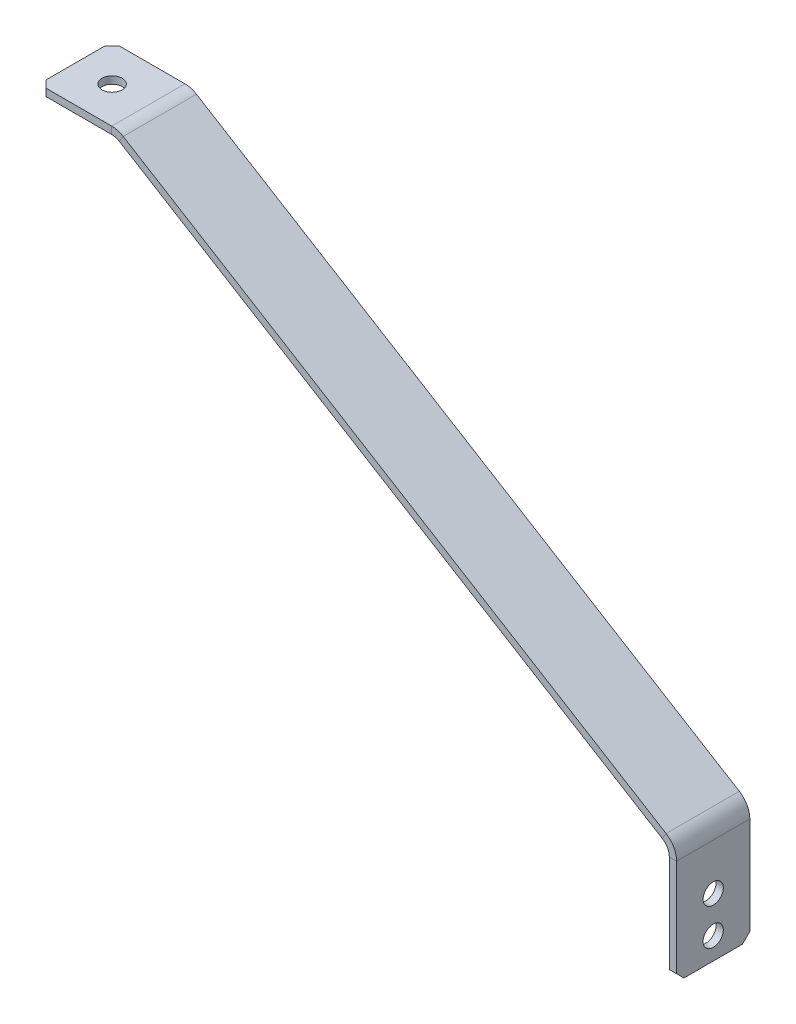
ISO-10303-21;
HEADER;
FILE_DESCRIPTION(('STEP AP214'),'2;1');
FILE_NAME('part.step','',(''),(''),'','','');
FILE_SCHEMA(('AUTOMOTIVE_DESIGN { 1 0 10303 214 1 1 1 1 }'));
ENDSEC;
DATA;
#1=APPLICATION_CONTEXT('core data for automotive mechanical design processes');
#2=APPLICATION_PROTOCOL_DEFINITION('international standard','automotive_design',2000,#1);
#3=PRODUCT_CONTEXT('',#1,'mechanical');
#4=PRODUCT('Part','Part','',(#3));
#5=PRODUCT_RELATED_PRODUCT_CATEGORY('part','',(#4));
#6=PRODUCT_DEFINITION_FORMATION('','',#4);
#7=PRODUCT_DEFINITION_CONTEXT('part definition',#1,'design');
#8=PRODUCT_DEFINITION('design','',#6,#7);
#9=PRODUCT_DEFINITION_SHAPE('','',#8);
#10=(LENGTH_UNIT() NAMED_UNIT(*) SI_UNIT(.MILLI.,.METRE.));
#11=(NAMED_UNIT(*) PLANE_ANGLE_UNIT() SI_UNIT($,.RADIAN.));
#12=(NAMED_UNIT(*) SI_UNIT($,.STERADIAN.) SOLID_ANGLE_UNIT());
#13=UNCERTAINTY_MEASURE_WITH_UNIT(LENGTH_MEASURE(1.E-05),#10,'distance_accuracy_value','');
#14=(GEOMETRIC_REPRESENTATION_CONTEXT(3) GLOBAL_UNCERTAINTY_ASSIGNED_CONTEXT((#13)) GLOBAL_UNIT_ASSIGNED_CONTEXT((#10,
#11,#12)) REPRESENTATION_CONTEXT('',''));
#15=CARTESIAN_POINT('',(0.,0.,0.));
#16=DIRECTION('',(0.,0.,1.));
#17=DIRECTION('',(1.,0.,0.));
#18=AXIS2_PLACEMENT_3D('',#15,#16,#17);
#19=CARTESIAN_POINT('',(-377.996045108346,311.294749823896,50.));
#20=DIRECTION('',(0.,0.,1.));
#21=DIRECTION('',(1.,0.,0.));
#22=AXIS2_PLACEMENT_3D('',#19,#20,#21);
#23=PLANE('',#22);
#24=DIRECTION('',(-0.521938169790312,-0.852983321593066,0.));
#25=VECTOR('',#24,1.);
#26=CARTESIAN_POINT('',(-377.996045108346,311.294749823896,50.));
#27=LINE('',#26,#25);
#28=CARTESIAN_POINT('',(-377.996045108346,311.294749823896,50.));
#29=VERTEX_POINT('',#28);
#30=CARTESIAN_POINT('',(-380.605735957297,307.029833215931,50.));
#31=VERTEX_POINT('',#30);
#32=EDGE_CURVE('E272',#29,#31,#27,.T.);
#33=ORIENTED_EDGE('',*,*,#32,.F.);
#34=CARTESIAN_POINT('',(-385.8251176552,298.5,50.));
#35=DIRECTION('',(0.,0.,1.));
#36=DIRECTION('',(1.,0.,0.));
#37=AXIS2_PLACEMENT_3D('',#34,#35,#36);
#38=CIRCLE('',#37,15.);
#39=CARTESIAN_POINT('',(-385.8251176552,313.5,50.));
#40=VERTEX_POINT('',#39);
#41=EDGE_CURVE('E191',#40,#29,#38,.F.);
#42=ORIENTED_EDGE('',*,*,#41,.F.);
#43=DIRECTION('',(0.,1.,0.));
#44=VECTOR('',#43,1.);
#45=CARTESIAN_POINT('',(-385.8251176552,308.5,50.));
#46=LINE('',#45,#44);
#47=CARTESIAN_POINT('',(-385.8251176552,308.5,50.));
#48=VERTEX_POINT('',#47);
#49=EDGE_CURVE('E269',#48,#40,#46,.T.);
#50=ORIENTED_EDGE('',*,*,#49,.F.);
#51=CARTESIAN_POINT('',(-385.8251176552,298.5,50.));
#52=DIRECTION('',(0.,0.,1.));
#53=DIRECTION('',(1.,0.,0.));
#54=AXIS2_PLACEMENT_3D('',#51,#52,#53);
#55=CIRCLE('',#54,10.);
#56=EDGE_CURVE('E201',#48,#31,#55,.F.);
#57=ORIENTED_EDGE('',*,*,#56,.T.);
#58=EDGE_LOOP('',(#33,#42,#50,#57));
#59=FACE_BOUND('',#58,.T.);
#60=ADVANCED_FACE('F43',(#59),#23,.T.);
#61=CARTESIAN_POINT('',(-385.8251176552,308.5,50.));
#62=DIRECTION('',(0.,0.,1.));
#63=DIRECTION('',(1.,0.,0.));
#64=AXIS2_PLACEMENT_3D('',#61,#62,#63);
#65=PLANE('',#64);
#66=DIRECTION('',(0.852983321593069,-0.521938169790307,0.));
#67=VECTOR('',#66,1.);
#68=CARTESIAN_POINT('',(0.,80.,50.));
#69=LINE('',#68,#67);
#70=CARTESIAN_POINT('',(-7.17092745314535,84.3878709651715,50.));
#71=VERTEX_POINT('',#70);
#72=EDGE_CURVE('E189',#29,#71,#69,.T.);
#73=ORIENTED_EDGE('',*,*,#72,.F.);
#74=ORIENTED_EDGE('',*,*,#32,.T.);
#75=DIRECTION('',(0.852983321593069,-0.521938169790307,0.));
#76=VECTOR('',#75,1.);
#77=CARTESIAN_POINT('',(-2.60969084895151,75.7350833920347,50.));
#78=LINE('',#77,#76);
#79=CARTESIAN_POINT('',(-9.7806183020969,80.1229543572062,50.));
#80=VERTEX_POINT('',#79);
#81=EDGE_CURVE('E204',#31,#80,#78,.T.);
#82=ORIENTED_EDGE('',*,*,#81,.T.);
#83=DIRECTION('',(0.521938169790307,0.852983321593069,0.));
#84=VECTOR('',#83,1.);
#85=CARTESIAN_POINT('',(-9.7806183020969,80.1229543572062,50.));
#86=LINE('',#85,#84);
#87=EDGE_CURVE('E166',#80,#71,#86,.T.);
#88=ORIENTED_EDGE('',*,*,#87,.T.);
#89=EDGE_LOOP('',(#73,#74,#82,#88));
#90=FACE_BOUND('',#89,.T.);
#91=ADVANCED_FACE('F370',(#90),#65,.T.);
#92=CARTESIAN_POINT('',(-385.8251176552,313.5,0.));
#93=DIRECTION('',(0.,0.,-1.));
#94=DIRECTION('',(-1.,0.,0.));
#95=AXIS2_PLACEMENT_3D('',#92,#93,#94);
#96=PLANE('',#95);
#97=DIRECTION('',(0.,-1.,0.));
#98=VECTOR('',#97,1.);
#99=CARTESIAN_POINT('',(-385.8251176552,313.5,0.));
#100=LINE('',#99,#98);
#101=CARTESIAN_POINT('',(-385.8251176552,313.5,0.));
#102=VERTEX_POINT('',#101);
#103=CARTESIAN_POINT('',(-385.8251176552,308.5,0.));
#104=VERTEX_POINT('',#103);
#105=EDGE_CURVE('E266',#102,#104,#100,.T.);
#106=ORIENTED_EDGE('',*,*,#105,.F.);
#107=CARTESIAN_POINT('',(-385.8251176552,298.5,0.));
#108=DIRECTION('',(0.,0.,1.));
#109=DIRECTION('',(1.,0.,0.));
#110=AXIS2_PLACEMENT_3D('',#107,#108,#109);
#111=CIRCLE('',#110,15.);
#112=CARTESIAN_POINT('',(-377.996045108346,311.294749823896,0.));
#113=VERTEX_POINT('',#112);
#114=EDGE_CURVE('E219',#102,#113,#111,.F.);
#115=ORIENTED_EDGE('',*,*,#114,.T.);
#116=DIRECTION('',(0.521938169790312,0.852983321593066,0.));
#117=VECTOR('',#116,1.);
#118=CARTESIAN_POINT('',(-380.605735957297,307.029833215931,0.));
#119=LINE('',#118,#117);
#120=CARTESIAN_POINT('',(-380.605735957297,307.029833215931,0.));
#121=VERTEX_POINT('',#120);
#122=EDGE_CURVE('E165',#121,#113,#119,.T.);
#123=ORIENTED_EDGE('',*,*,#122,.F.);
#124=CARTESIAN_POINT('',(-385.8251176552,298.5,0.));
#125=DIRECTION('',(0.,0.,1.));
#126=DIRECTION('',(1.,0.,0.));
#127=AXIS2_PLACEMENT_3D('',#124,#125,#126);
#128=CIRCLE('',#127,10.);
#129=EDGE_CURVE('E226',#104,#121,#128,.F.);
#130=ORIENTED_EDGE('',*,*,#129,.F.);
#131=EDGE_LOOP('',(#106,#115,#123,#130));
#132=FACE_BOUND('',#131,.T.);
#133=ADVANCED_FACE('F377',(#132),#96,.T.);
#134=CARTESIAN_POINT('',(-380.605735957297,307.029833215931,0.));
#135=DIRECTION('',(0.,0.,-1.));
#136=DIRECTION('',(-1.,0.,0.));
#137=AXIS2_PLACEMENT_3D('',#134,#135,#136);
#138=PLANE('',#137);
#139=DIRECTION('',(1.,0.,0.));
#140=VECTOR('',#139,1.);
#141=CARTESIAN_POINT('',(-435.6,308.5,0.));
#142=LINE('',#141,#140);
#143=CARTESIAN_POINT('',(-430.6,308.5,0.));
#144=VERTEX_POINT('',#143);
#145=EDGE_CURVE('E224',#144,#104,#142,.T.);
#146=ORIENTED_EDGE('',*,*,#145,.F.);
#147=DIRECTION('',(0.,1.,0.));
#148=VECTOR('',#147,1.);
#149=CARTESIAN_POINT('',(-430.6,307.029833215931,0.));
#150=LINE('',#149,#148);
#151=CARTESIAN_POINT('',(-430.6,313.5,0.));
#152=VERTEX_POINT('',#151);
#153=EDGE_CURVE('E274',#144,#152,#150,.T.);
#154=ORIENTED_EDGE('',*,*,#153,.T.);
#155=DIRECTION('',(1.,0.,0.));
#156=VECTOR('',#155,1.);
#157=CARTESIAN_POINT('',(-435.6,313.5,0.));
#158=LINE('',#157,#156);
#159=EDGE_CURVE('E222',#152,#102,#158,.T.);
#160=ORIENTED_EDGE('',*,*,#159,.T.);
#161=ORIENTED_EDGE('',*,*,#105,.T.);
#162=EDGE_LOOP('',(#146,#154,#160,#161));
#163=FACE_BOUND('',#162,.T.);
#164=ADVANCED_FACE('F597',(#163),#138,.T.);
#165=CARTESIAN_POINT('',(0.,71.5931211412755,50.));
#166=DIRECTION('',(0.,0.,1.));
#167=DIRECTION('',(1.,0.,0.));
#168=AXIS2_PLACEMENT_3D('',#165,#166,#167);
#169=PLANE('',#168);
#170=DIRECTION('',(-1.,0.,0.));
#171=VECTOR('',#170,1.);
#172=CARTESIAN_POINT('',(0.,71.5931211412755,50.));
#173=LINE('',#172,#171);
#174=CARTESIAN_POINT('',(0.,71.5931211412755,50.));
#175=VERTEX_POINT('',#174);
#176=CARTESIAN_POINT('',(-4.99999999999997,71.5931211412755,50.));
#177=VERTEX_POINT('',#176);
#178=EDGE_CURVE('E156',#175,#177,#173,.T.);
#179=ORIENTED_EDGE('',*,*,#178,.F.);
#180=CARTESIAN_POINT('',(-15.,71.5931211412755,50.));
#181=DIRECTION('',(0.,0.,1.));
#182=DIRECTION('',(1.,0.,0.));
#183=AXIS2_PLACEMENT_3D('',#180,#181,#182);
#184=CIRCLE('',#183,15.);
#185=EDGE_CURVE('E160',#71,#175,#184,.F.);
#186=ORIENTED_EDGE('',*,*,#185,.F.);
#187=ORIENTED_EDGE('',*,*,#87,.F.);
#188=CARTESIAN_POINT('',(-15.,71.5931211412755,50.));
#189=DIRECTION('',(0.,0.,1.));
#190=DIRECTION('',(1.,0.,0.));
#191=AXIS2_PLACEMENT_3D('',#188,#189,#190);
#192=CIRCLE('',#191,10.);
#193=EDGE_CURVE('E163',#80,#177,#192,.F.);
#194=ORIENTED_EDGE('',*,*,#193,.T.);
#195=EDGE_LOOP('',(#179,#186,#187,#194));
#196=FACE_BOUND('',#195,.T.);
#197=ADVANCED_FACE('F158',(#196),#169,.T.);
#198=CARTESIAN_POINT('',(-9.7806183020969,80.1229543572062,50.));
#199=DIRECTION('',(0.,0.,1.));
#200=DIRECTION('',(1.,0.,0.));
#201=AXIS2_PLACEMENT_3D('',#198,#199,#200);
#202=PLANE('',#201);
#203=DIRECTION('',(0.,-1.,0.));
#204=VECTOR('',#203,1.);
#205=CARTESIAN_POINT('',(-4.99999999999997,80.,50.));
#206=LINE('',#205,#204);
#207=CARTESIAN_POINT('',(-5.,5.,50.));
#208=VERTEX_POINT('',#207);
#209=EDGE_CURVE('E184',#177,#208,#206,.T.);
#210=ORIENTED_EDGE('',*,*,#209,.T.);
#211=DIRECTION('',(1.,0.,0.));
#212=VECTOR('',#211,1.);
#213=CARTESIAN_POINT('',(-9.7806183020969,5.,50.));
#214=LINE('',#213,#212);
#215=CARTESIAN_POINT('',(0.,5.,50.));
#216=VERTEX_POINT('',#215);
#217=EDGE_CURVE('E51',#208,#216,#214,.T.);
#218=ORIENTED_EDGE('',*,*,#217,.T.);
#219=DIRECTION('',(0.,-1.,0.));
#220=VECTOR('',#219,1.);
#221=CARTESIAN_POINT('',(0.,80.,50.));
#222=LINE('',#221,#220);
#223=EDGE_CURVE('E173',#175,#216,#222,.T.);
#224=ORIENTED_EDGE('',*,*,#223,.F.);
#225=ORIENTED_EDGE('',*,*,#178,.T.);
#226=EDGE_LOOP('',(#210,#218,#224,#225));
#227=FACE_BOUND('',#226,.T.);
#228=ADVANCED_FACE('F183',(#227),#202,.T.);
#229=CARTESIAN_POINT('',(-7.17092745314535,84.3878709651715,0.));
#230=DIRECTION('',(0.,0.,-1.));
#231=DIRECTION('',(-1.,0.,0.));
#232=AXIS2_PLACEMENT_3D('',#229,#230,#231);
#233=PLANE('',#232);
#234=DIRECTION('',(-0.521938169790307,-0.852983321593069,0.));
#235=VECTOR('',#234,1.);
#236=CARTESIAN_POINT('',(-7.17092745314535,84.3878709651715,0.));
#237=LINE('',#236,#235);
#238=CARTESIAN_POINT('',(-7.17092745314535,84.3878709651715,0.));
#239=VERTEX_POINT('',#238);
#240=CARTESIAN_POINT('',(-9.7806183020969,80.1229543572062,0.));
#241=VERTEX_POINT('',#240);
#242=EDGE_CURVE('E262',#239,#241,#237,.T.);
#243=ORIENTED_EDGE('',*,*,#242,.F.);
#244=CARTESIAN_POINT('',(-15.,71.5931211412755,0.));
#245=DIRECTION('',(0.,0.,1.));
#246=DIRECTION('',(1.,0.,0.));
#247=AXIS2_PLACEMENT_3D('',#244,#245,#246);
#248=CIRCLE('',#247,15.);
#249=CARTESIAN_POINT('',(0.,71.5931211412755,0.));
#250=VERTEX_POINT('',#249);
#251=EDGE_CURVE('E214',#239,#250,#248,.F.);
#252=ORIENTED_EDGE('',*,*,#251,.T.);
#253=DIRECTION('',(1.,0.,0.));
#254=VECTOR('',#253,1.);
#255=CARTESIAN_POINT('',(-4.99999999999997,71.5931211412755,0.));
#256=LINE('',#255,#254);
#257=CARTESIAN_POINT('',(-4.99999999999997,71.5931211412755,0.));
#258=VERTEX_POINT('',#257);
#259=EDGE_CURVE('E260',#258,#250,#256,.T.);
#260=ORIENTED_EDGE('',*,*,#259,.F.);
#261=CARTESIAN_POINT('',(-15.,71.5931211412755,0.));
#262=DIRECTION('',(0.,0.,1.));
#263=DIRECTION('',(1.,0.,0.));
#264=AXIS2_PLACEMENT_3D('',#261,#262,#263);
#265=CIRCLE('',#264,10.);
#266=EDGE_CURVE('E232',#241,#258,#265,.F.);
#267=ORIENTED_EDGE('',*,*,#266,.F.);
#268=EDGE_LOOP('',(#243,#252,#260,#267));
#269=FACE_BOUND('',#268,.T.);
#270=ADVANCED_FACE('F334',(#269),#233,.T.);
#271=CARTESIAN_POINT('',(-4.99999999999997,71.5931211412755,0.));
#272=DIRECTION('',(0.,0.,-1.));
#273=DIRECTION('',(-1.,0.,0.));
#274=AXIS2_PLACEMENT_3D('',#271,#272,#273);
#275=PLANE('',#274);
#276=DIRECTION('',(0.852983321593069,-0.521938169790307,0.));
#277=VECTOR('',#276,1.);
#278=CARTESIAN_POINT('',(0.,80.,0.));
#279=LINE('',#278,#277);
#280=EDGE_CURVE('E216',#113,#239,#279,.T.);
#281=ORIENTED_EDGE('',*,*,#280,.T.);
#282=ORIENTED_EDGE('',*,*,#242,.T.);
#283=DIRECTION('',(0.852983321593069,-0.521938169790307,0.));
#284=VECTOR('',#283,1.);
#285=CARTESIAN_POINT('',(-2.60969084895151,75.7350833920347,0.));
#286=LINE('',#285,#284);
#287=EDGE_CURVE('E229',#121,#241,#286,.T.);
#288=ORIENTED_EDGE('',*,*,#287,.F.);
#289=ORIENTED_EDGE('',*,*,#122,.T.);
#290=EDGE_LOOP('',(#281,#282,#288,#289));
#291=FACE_BOUND('',#290,.T.);
#292=ADVANCED_FACE('F351',(#291),#275,.T.);
#293=CARTESIAN_POINT('',(-4.99999999999997,80.,50.));
#294=DIRECTION('',(1.,0.,0.));
#295=DIRECTION('',(0.,1.,0.));
#296=AXIS2_PLACEMENT_3D('',#293,#294,#295);
#297=PLANE('',#296);
#298=CARTESIAN_POINT('',(-5.00000000000001,40.,25.));
#299=DIRECTION('',(-1.,0.,0.));
#300=DIRECTION('',(0.,-1.,0.));
#301=AXIS2_PLACEMENT_3D('',#298,#299,#300);
#302=CIRCLE('',#301,6.90000000000001);
#303=CARTESIAN_POINT('',(-5.00000000000001,33.1,25.));
#304=VERTEX_POINT('',#303);
#305=EDGE_CURVE('E282',#304,#304,#302,.T.);
#306=ORIENTED_EDGE('',*,*,#305,.F.);
#307=EDGE_LOOP('',(#306));
#308=FACE_BOUND('',#307,.T.);
#309=CARTESIAN_POINT('',(-5.,15.,25.));
#310=DIRECTION('',(-1.,0.,0.));
#311=DIRECTION('',(0.,-1.,0.));
#312=AXIS2_PLACEMENT_3D('',#309,#310,#311);
#313=CIRCLE('',#312,6.90000000000001);
#314=CARTESIAN_POINT('',(-5.,8.09999999999999,25.));
#315=VERTEX_POINT('',#314);
#316=EDGE_CURVE('E341',#315,#315,#313,.T.);
#317=ORIENTED_EDGE('',*,*,#316,.F.);
#318=EDGE_LOOP('',(#317));
#319=FACE_BOUND('',#318,.T.);
#320=DIRECTION('',(0.,0.,-1.));
#321=VECTOR('',#320,1.);
#322=CARTESIAN_POINT('',(-5.,0.,50.));
#323=LINE('',#322,#321);
#324=CARTESIAN_POINT('',(-5.,0.,45.));
#325=VERTEX_POINT('',#324);
#326=CARTESIAN_POINT('',(-5.,0.,5.));
#327=VERTEX_POINT('',#326);
#328=EDGE_CURVE('E258',#325,#327,#323,.T.);
#329=ORIENTED_EDGE('',*,*,#328,.F.);
#330=DIRECTION('',(0.,-0.707106781186548,-0.707106781186547));
#331=VECTOR('',#330,1.);
#332=CARTESIAN_POINT('',(-5.,0.,45.));
#333=LINE('',#332,#331);
#334=EDGE_CURVE('E65',#325,#208,#333,.F.);
#335=ORIENTED_EDGE('',*,*,#334,.T.);
#336=ORIENTED_EDGE('',*,*,#209,.F.);
#337=DIRECTION('',(0.,0.,-1.));
#338=VECTOR('',#337,1.);
#339=CARTESIAN_POINT('',(-4.99999999999997,71.5931211412755,50.));
#340=LINE('',#339,#338);
#341=EDGE_CURVE('E208',#177,#258,#340,.T.);
#342=ORIENTED_EDGE('',*,*,#341,.T.);
#343=DIRECTION('',(0.,-1.,0.));
#344=VECTOR('',#343,1.);
#345=CARTESIAN_POINT('',(-4.99999999999997,80.,0.));
#346=LINE('',#345,#344);
#347=CARTESIAN_POINT('',(-5.,5.,0.));
#348=VERTEX_POINT('',#347);
#349=EDGE_CURVE('E209',#258,#348,#346,.T.);
#350=ORIENTED_EDGE('',*,*,#349,.T.);
#351=DIRECTION('',(0.,-0.707106781186548,0.707106781186547));
#352=VECTOR('',#351,1.);
#353=CARTESIAN_POINT('',(-5.,5.,0.));
#354=LINE('',#353,#352);
#355=EDGE_CURVE('E307',#348,#327,#354,.T.);
#356=ORIENTED_EDGE('',*,*,#355,.T.);
#357=EDGE_LOOP('',(#329,#335,#336,#342,#350,#356));
#358=FACE_BOUND('',#357,.T.);
#359=ADVANCED_FACE('F323',(#308,#319,#358),#297,.F.);
#360=CARTESIAN_POINT('',(0.,0.,50.));
#361=DIRECTION('',(0.,-1.,0.));
#362=DIRECTION('',(0.,0.,-1.));
#363=AXIS2_PLACEMENT_3D('',#360,#361,#362);
#364=PLANE('',#363);
#365=DIRECTION('',(0.,0.,-1.));
#366=VECTOR('',#365,1.);
#367=CARTESIAN_POINT('',(0.,0.,50.));
#368=LINE('',#367,#366);
#369=CARTESIAN_POINT('',(0.,0.,45.));
#370=VERTEX_POINT('',#369);
#371=CARTESIAN_POINT('',(0.,0.,5.));
#372=VERTEX_POINT('',#371);
#373=EDGE_CURVE('E180',#370,#372,#368,.T.);
#374=ORIENTED_EDGE('',*,*,#373,.F.);
#375=DIRECTION('',(-1.,0.,0.));
#376=VECTOR('',#375,1.);
#377=CARTESIAN_POINT('',(0.,0.,45.));
#378=LINE('',#377,#376);
#379=EDGE_CURVE('E315',#370,#325,#378,.T.);
#380=ORIENTED_EDGE('',*,*,#379,.T.);
#381=ORIENTED_EDGE('',*,*,#328,.T.);
#382=DIRECTION('',(1.,0.,0.));
#383=VECTOR('',#382,1.);
#384=CARTESIAN_POINT('',(0.,0.,5.));
#385=LINE('',#384,#383);
#386=EDGE_CURVE('E310',#327,#372,#385,.T.);
#387=ORIENTED_EDGE('',*,*,#386,.T.);
#388=EDGE_LOOP('',(#374,#380,#381,#387));
#389=FACE_BOUND('',#388,.T.);
#390=ADVANCED_FACE('F321',(#389),#364,.T.);
#391=CARTESIAN_POINT('',(0.,80.,50.));
#392=DIRECTION('',(1.,0.,0.));
#393=DIRECTION('',(0.,1.,0.));
#394=AXIS2_PLACEMENT_3D('',#391,#392,#393);
#395=PLANE('',#394);
#396=CARTESIAN_POINT('',(0.,40.,25.));
#397=DIRECTION('',(1.,0.,0.));
#398=DIRECTION('',(0.,1.,0.));
#399=AXIS2_PLACEMENT_3D('',#396,#397,#398);
#400=CIRCLE('',#399,6.90000000000001);
#401=CARTESIAN_POINT('',(0.,46.9,25.));
#402=VERTEX_POINT('',#401);
#403=EDGE_CURVE('E281',#402,#402,#400,.T.);
#404=ORIENTED_EDGE('',*,*,#403,.F.);
#405=EDGE_LOOP('',(#404));
#406=FACE_BOUND('',#405,.T.);
#407=CARTESIAN_POINT('',(0.,15.,25.));
#408=DIRECTION('',(1.,0.,0.));
#409=DIRECTION('',(0.,1.,0.));
#410=AXIS2_PLACEMENT_3D('',#407,#408,#409);
#411=CIRCLE('',#410,6.90000000000001);
#412=CARTESIAN_POINT('',(0.,21.9,25.));
#413=VERTEX_POINT('',#412);
#414=EDGE_CURVE('E278',#413,#413,#411,.T.);
#415=ORIENTED_EDGE('',*,*,#414,.F.);
#416=EDGE_LOOP('',(#415));
#417=FACE_BOUND('',#416,.T.);
#418=ORIENTED_EDGE('',*,*,#223,.T.);
#419=DIRECTION('',(0.,0.707106781186548,0.707106781186547));
#420=VECTOR('',#419,1.);
#421=CARTESIAN_POINT('',(0.,42.5000000000001,87.5));
#422=LINE('',#421,#420);
#423=EDGE_CURVE('E11',#216,#370,#422,.F.);
#424=ORIENTED_EDGE('',*,*,#423,.T.);
#425=ORIENTED_EDGE('',*,*,#373,.T.);
#426=DIRECTION('',(0.,0.707106781186548,-0.707106781186547));
#427=VECTOR('',#426,1.);
#428=CARTESIAN_POINT('',(0.,17.5,-12.5));
#429=LINE('',#428,#427);
#430=CARTESIAN_POINT('',(0.,5.,0.));
#431=VERTEX_POINT('',#430);
#432=EDGE_CURVE('E313',#372,#431,#429,.T.);
#433=ORIENTED_EDGE('',*,*,#432,.T.);
#434=DIRECTION('',(0.,-1.,0.));
#435=VECTOR('',#434,1.);
#436=CARTESIAN_POINT('',(0.,80.,0.));
#437=LINE('',#436,#435);
#438=EDGE_CURVE('E176',#250,#431,#437,.T.);
#439=ORIENTED_EDGE('',*,*,#438,.F.);
#440=DIRECTION('',(0.,0.,-1.));
#441=VECTOR('',#440,1.);
#442=CARTESIAN_POINT('',(0.,71.5931211412755,50.));
#443=LINE('',#442,#441);
#444=EDGE_CURVE('E171',#175,#250,#443,.T.);
#445=ORIENTED_EDGE('',*,*,#444,.F.);
#446=EDGE_LOOP('',(#418,#424,#425,#433,#439,#445));
#447=FACE_BOUND('',#446,.T.);
#448=ADVANCED_FACE('F172',(#406,#417,#447),#395,.T.);
#449=CARTESIAN_POINT('',(-15.,71.5931211412755,50.));
#450=DIRECTION('',(0.,0.,-1.));
#451=DIRECTION('',(-1.,0.,0.));
#452=AXIS2_PLACEMENT_3D('',#449,#450,#451);
#453=CYLINDRICAL_SURFACE('',#452,15.);
#454=ORIENTED_EDGE('',*,*,#251,.F.);
#455=DIRECTION('',(0.,0.,-1.));
#456=VECTOR('',#455,1.);
#457=CARTESIAN_POINT('',(-7.17092745314535,84.3878709651715,50.));
#458=LINE('',#457,#456);
#459=EDGE_CURVE('E181',#71,#239,#458,.T.);
#460=ORIENTED_EDGE('',*,*,#459,.F.);
#461=ORIENTED_EDGE('',*,*,#185,.T.);
#462=ORIENTED_EDGE('',*,*,#444,.T.);
#463=EDGE_LOOP('',(#454,#460,#461,#462));
#464=FACE_BOUND('',#463,.T.);
#465=ADVANCED_FACE('F187',(#464),#453,.T.);
#466=CARTESIAN_POINT('',(0.,80.,50.));
#467=DIRECTION('',(0.521938169790307,0.852983321593069,0.));
#468=DIRECTION('',(-0.852983321593069,0.521938169790307,0.));
#469=AXIS2_PLACEMENT_3D('',#466,#467,#468);
#470=PLANE('',#469);
#471=ORIENTED_EDGE('',*,*,#280,.F.);
#472=DIRECTION('',(0.,0.,-1.));
#473=VECTOR('',#472,1.);
#474=CARTESIAN_POINT('',(-377.996045108346,311.294749823896,50.));
#475=LINE('',#474,#473);
#476=EDGE_CURVE('E253',#29,#113,#475,.T.);
#477=ORIENTED_EDGE('',*,*,#476,.F.);
#478=ORIENTED_EDGE('',*,*,#72,.T.);
#479=ORIENTED_EDGE('',*,*,#459,.T.);
#480=EDGE_LOOP('',(#471,#477,#478,#479));
#481=FACE_BOUND('',#480,.T.);
#482=ADVANCED_FACE('F524',(#481),#470,.T.);
#483=CARTESIAN_POINT('',(-385.8251176552,298.5,50.));
#484=DIRECTION('',(0.,0.,-1.));
#485=DIRECTION('',(-1.,0.,0.));
#486=AXIS2_PLACEMENT_3D('',#483,#484,#485);
#487=CYLINDRICAL_SURFACE('',#486,15.);
#488=ORIENTED_EDGE('',*,*,#114,.F.);
#489=DIRECTION('',(0.,0.,-1.));
#490=VECTOR('',#489,1.);
#491=CARTESIAN_POINT('',(-385.8251176552,313.5,50.));
#492=LINE('',#491,#490);
#493=EDGE_CURVE('E250',#40,#102,#492,.T.);
#494=ORIENTED_EDGE('',*,*,#493,.F.);
#495=ORIENTED_EDGE('',*,*,#41,.T.);
#496=ORIENTED_EDGE('',*,*,#476,.T.);
#497=EDGE_LOOP('',(#488,#494,#495,#496));
#498=FACE_BOUND('',#497,.T.);
#499=ADVANCED_FACE('F515',(#498),#487,.T.);
#500=CARTESIAN_POINT('',(-435.6,313.5,50.));
#501=DIRECTION('',(0.,1.,0.));
#502=DIRECTION('',(0.,0.,1.));
#503=AXIS2_PLACEMENT_3D('',#500,#501,#502);
#504=PLANE('',#503);
#505=CARTESIAN_POINT('',(-410.6,313.5,25.));
#506=DIRECTION('',(0.,1.,0.));
#507=DIRECTION('',(-1.,0.,0.));
#508=AXIS2_PLACEMENT_3D('',#505,#506,#507);
#509=CIRCLE('',#508,6.89999999999999);
#510=CARTESIAN_POINT('',(-417.5,313.5,25.));
#511=VERTEX_POINT('',#510);
#512=EDGE_CURVE('E277',#511,#511,#509,.T.);
#513=ORIENTED_EDGE('',*,*,#512,.F.);
#514=EDGE_LOOP('',(#513));
#515=FACE_BOUND('',#514,.T.);
#516=DIRECTION('',(0.,0.,-1.));
#517=VECTOR('',#516,1.);
#518=CARTESIAN_POINT('',(-435.6,313.5,50.));
#519=LINE('',#518,#517);
#520=CARTESIAN_POINT('',(-435.6,313.5,45.));
#521=VERTEX_POINT('',#520);
#522=CARTESIAN_POINT('',(-435.6,313.5,5.));
#523=VERTEX_POINT('',#522);
#524=EDGE_CURVE('E248',#521,#523,#519,.T.);
#525=ORIENTED_EDGE('',*,*,#524,.F.);
#526=DIRECTION('',(-0.707106781186548,0.,-0.707106781186547));
#527=VECTOR('',#526,1.);
#528=CARTESIAN_POINT('',(-433.1,313.5,47.5));
#529=LINE('',#528,#527);
#530=CARTESIAN_POINT('',(-430.6,313.5,50.));
#531=VERTEX_POINT('',#530);
#532=EDGE_CURVE('E298',#521,#531,#529,.F.);
#533=ORIENTED_EDGE('',*,*,#532,.T.);
#534=DIRECTION('',(1.,0.,0.));
#535=VECTOR('',#534,1.);
#536=CARTESIAN_POINT('',(-435.6,313.5,50.));
#537=LINE('',#536,#535);
#538=EDGE_CURVE('E197',#531,#40,#537,.T.);
#539=ORIENTED_EDGE('',*,*,#538,.T.);
#540=ORIENTED_EDGE('',*,*,#493,.T.);
#541=ORIENTED_EDGE('',*,*,#159,.F.);
#542=DIRECTION('',(0.707106781186548,0.,-0.707106781186547));
#543=VECTOR('',#542,1.);
#544=CARTESIAN_POINT('',(-458.1,313.5,27.5));
#545=LINE('',#544,#543);
#546=EDGE_CURVE('E287',#152,#523,#545,.F.);
#547=ORIENTED_EDGE('',*,*,#546,.T.);
#548=EDGE_LOOP('',(#525,#533,#539,#540,#541,#547));
#549=FACE_BOUND('',#548,.T.);
#550=ADVANCED_FACE('F505',(#515,#549),#504,.T.);
#551=CARTESIAN_POINT('',(-435.6,308.5,50.));
#552=DIRECTION('',(-1.,0.,0.));
#553=DIRECTION('',(0.,0.,1.));
#554=AXIS2_PLACEMENT_3D('',#551,#552,#553);
#555=PLANE('',#554);
#556=DIRECTION('',(0.,0.,-1.));
#557=VECTOR('',#556,1.);
#558=CARTESIAN_POINT('',(-435.6,308.5,50.));
#559=LINE('',#558,#557);
#560=CARTESIAN_POINT('',(-435.6,308.5,45.));
#561=VERTEX_POINT('',#560);
#562=CARTESIAN_POINT('',(-435.6,308.5,5.));
#563=VERTEX_POINT('',#562);
#564=EDGE_CURVE('E246',#561,#563,#559,.T.);
#565=ORIENTED_EDGE('',*,*,#564,.F.);
#566=DIRECTION('',(0.,1.,0.));
#567=VECTOR('',#566,1.);
#568=CARTESIAN_POINT('',(-435.6,308.5,45.));
#569=LINE('',#568,#567);
#570=EDGE_CURVE('E295',#561,#521,#569,.T.);
#571=ORIENTED_EDGE('',*,*,#570,.T.);
#572=ORIENTED_EDGE('',*,*,#524,.T.);
#573=DIRECTION('',(0.,-1.,0.));
#574=VECTOR('',#573,1.);
#575=CARTESIAN_POINT('',(-435.6,308.5,5.));
#576=LINE('',#575,#574);
#577=EDGE_CURVE('E290',#523,#563,#576,.T.);
#578=ORIENTED_EDGE('',*,*,#577,.T.);
#579=EDGE_LOOP('',(#565,#571,#572,#578));
#580=FACE_BOUND('',#579,.T.);
#581=ADVANCED_FACE('F495',(#580),#555,.T.);
#582=CARTESIAN_POINT('',(-435.6,308.5,50.));
#583=DIRECTION('',(0.,1.,0.));
#584=DIRECTION('',(0.,0.,1.));
#585=AXIS2_PLACEMENT_3D('',#582,#583,#584);
#586=PLANE('',#585);
#587=CARTESIAN_POINT('',(-410.6,308.5,25.));
#588=DIRECTION('',(0.,1.,0.));
#589=DIRECTION('',(0.,0.,1.));
#590=AXIS2_PLACEMENT_3D('',#587,#588,#589);
#591=CIRCLE('',#590,6.89999999999999);
#592=CARTESIAN_POINT('',(-410.6,308.5,31.9));
#593=VERTEX_POINT('',#592);
#594=EDGE_CURVE('E212',#593,#593,#591,.T.);
#595=ORIENTED_EDGE('',*,*,#594,.T.);
#596=EDGE_LOOP('',(#595));
#597=FACE_BOUND('',#596,.T.);
#598=DIRECTION('',(1.,0.,0.));
#599=VECTOR('',#598,1.);
#600=CARTESIAN_POINT('',(-435.6,308.5,50.));
#601=LINE('',#600,#599);
#602=CARTESIAN_POINT('',(-430.6,308.5,50.));
#603=VERTEX_POINT('',#602);
#604=EDGE_CURVE('E199',#603,#48,#601,.T.);
#605=ORIENTED_EDGE('',*,*,#604,.F.);
#606=DIRECTION('',(0.707106781186548,0.,0.707106781186547));
#607=VECTOR('',#606,1.);
#608=CARTESIAN_POINT('',(-435.6,308.5,45.));
#609=LINE('',#608,#607);
#610=EDGE_CURVE('E302',#603,#561,#609,.F.);
#611=ORIENTED_EDGE('',*,*,#610,.T.);
#612=ORIENTED_EDGE('',*,*,#564,.T.);
#613=DIRECTION('',(-0.707106781186548,0.,0.707106781186547));
#614=VECTOR('',#613,1.);
#615=CARTESIAN_POINT('',(-430.6,308.5,0.));
#616=LINE('',#615,#614);
#617=EDGE_CURVE('E293',#563,#144,#616,.F.);
#618=ORIENTED_EDGE('',*,*,#617,.T.);
#619=ORIENTED_EDGE('',*,*,#145,.T.);
#620=DIRECTION('',(0.,0.,-1.));
#621=VECTOR('',#620,1.);
#622=CARTESIAN_POINT('',(-385.8251176552,308.5,50.));
#623=LINE('',#622,#621);
#624=EDGE_CURVE('E243',#48,#104,#623,.T.);
#625=ORIENTED_EDGE('',*,*,#624,.F.);
#626=EDGE_LOOP('',(#605,#611,#612,#618,#619,#625));
#627=FACE_BOUND('',#626,.T.);
#628=ADVANCED_FACE('F484',(#597,#627),#586,.F.);
#629=CARTESIAN_POINT('',(-385.8251176552,298.5,50.));
#630=DIRECTION('',(0.,0.,-1.));
#631=DIRECTION('',(-1.,0.,0.));
#632=AXIS2_PLACEMENT_3D('',#629,#630,#631);
#633=CYLINDRICAL_SURFACE('',#632,10.);
#634=ORIENTED_EDGE('',*,*,#129,.T.);
#635=DIRECTION('',(0.,0.,-1.));
#636=VECTOR('',#635,1.);
#637=CARTESIAN_POINT('',(-380.605735957297,307.029833215931,50.));
#638=LINE('',#637,#636);
#639=EDGE_CURVE('E240',#31,#121,#638,.T.);
#640=ORIENTED_EDGE('',*,*,#639,.F.);
#641=ORIENTED_EDGE('',*,*,#56,.F.);
#642=ORIENTED_EDGE('',*,*,#624,.T.);
#643=EDGE_LOOP('',(#634,#640,#641,#642));
#644=FACE_BOUND('',#643,.T.);
#645=ADVANCED_FACE('F473',(#644),#633,.F.);
#646=CARTESIAN_POINT('',(-2.60969084895151,75.7350833920347,50.));
#647=DIRECTION('',(0.521938169790307,0.852983321593069,0.));
#648=DIRECTION('',(-0.852983321593069,0.521938169790307,0.));
#649=AXIS2_PLACEMENT_3D('',#646,#647,#648);
#650=PLANE('',#649);
#651=ORIENTED_EDGE('',*,*,#287,.T.);
#652=DIRECTION('',(0.,0.,-1.));
#653=VECTOR('',#652,1.);
#654=CARTESIAN_POINT('',(-9.7806183020969,80.1229543572062,50.));
#655=LINE('',#654,#653);
#656=EDGE_CURVE('E237',#80,#241,#655,.T.);
#657=ORIENTED_EDGE('',*,*,#656,.F.);
#658=ORIENTED_EDGE('',*,*,#81,.F.);
#659=ORIENTED_EDGE('',*,*,#639,.T.);
#660=EDGE_LOOP('',(#651,#657,#658,#659));
#661=FACE_BOUND('',#660,.T.);
#662=ADVANCED_FACE('F463',(#661),#650,.F.);
#663=CARTESIAN_POINT('',(-15.,71.5931211412755,50.));
#664=DIRECTION('',(0.,0.,-1.));
#665=DIRECTION('',(-1.,0.,0.));
#666=AXIS2_PLACEMENT_3D('',#663,#664,#665);
#667=CYLINDRICAL_SURFACE('',#666,10.);
#668=ORIENTED_EDGE('',*,*,#266,.T.);
#669=ORIENTED_EDGE('',*,*,#341,.F.);
#670=ORIENTED_EDGE('',*,*,#193,.F.);
#671=ORIENTED_EDGE('',*,*,#656,.T.);
#672=EDGE_LOOP('',(#668,#669,#670,#671));
#673=FACE_BOUND('',#672,.T.);
#674=ADVANCED_FACE('F336',(#673),#667,.F.);
#675=CARTESIAN_POINT('',(-15.,71.5931211412755,50.));
#676=DIRECTION('',(0.,0.,1.));
#677=DIRECTION('',(1.,0.,0.));
#678=AXIS2_PLACEMENT_3D('',#675,#676,#677);
#679=PLANE('',#678);
#680=ORIENTED_EDGE('',*,*,#538,.F.);
#681=DIRECTION('',(0.,-1.,0.));
#682=VECTOR('',#681,1.);
#683=CARTESIAN_POINT('',(-430.6,71.5931211412755,50.));
#684=LINE('',#683,#682);
#685=EDGE_CURVE('E300',#531,#603,#684,.T.);
#686=ORIENTED_EDGE('',*,*,#685,.T.);
#687=ORIENTED_EDGE('',*,*,#604,.T.);
#688=ORIENTED_EDGE('',*,*,#49,.T.);
#689=EDGE_LOOP('',(#680,#686,#687,#688));
#690=FACE_BOUND('',#689,.T.);
#691=ADVANCED_FACE('F442',(#690),#679,.T.);
#692=CARTESIAN_POINT('',(-15.,71.5931211412755,0.));
#693=DIRECTION('',(0.,0.,1.));
#694=DIRECTION('',(1.,0.,0.));
#695=AXIS2_PLACEMENT_3D('',#692,#693,#694);
#696=PLANE('',#695);
#697=ORIENTED_EDGE('',*,*,#438,.T.);
#698=DIRECTION('',(-1.,0.,0.));
#699=VECTOR('',#698,1.);
#700=CARTESIAN_POINT('',(-5.,5.,0.));
#701=LINE('',#700,#699);
#702=EDGE_CURVE('E304',#431,#348,#701,.T.);
#703=ORIENTED_EDGE('',*,*,#702,.T.);
#704=ORIENTED_EDGE('',*,*,#349,.F.);
#705=ORIENTED_EDGE('',*,*,#259,.T.);
#706=EDGE_LOOP('',(#697,#703,#704,#705));
#707=FACE_BOUND('',#706,.T.);
#708=ADVANCED_FACE('F331',(#707),#696,.F.);
#709=CARTESIAN_POINT('',(-410.6,303.5,25.));
#710=DIRECTION('',(0.,1.,0.));
#711=DIRECTION('',(-1.,0.,0.));
#712=AXIS2_PLACEMENT_3D('',#709,#710,#711);
#713=CYLINDRICAL_SURFACE('',#712,6.89999999999999);
#714=ORIENTED_EDGE('',*,*,#512,.T.);
#715=EDGE_LOOP('',(#714));
#716=FACE_BOUND('',#715,.T.);
#717=ORIENTED_EDGE('',*,*,#594,.F.);
#718=EDGE_LOOP('',(#717));
#719=FACE_BOUND('',#718,.T.);
#720=ADVANCED_FACE('F357',(#716,#719),#713,.F.);
#721=CARTESIAN_POINT('',(5.,15.,25.));
#722=DIRECTION('',(-1.,0.,0.));
#723=DIRECTION('',(0.,-1.,0.));
#724=AXIS2_PLACEMENT_3D('',#721,#722,#723);
#725=CYLINDRICAL_SURFACE('',#724,6.90000000000001);
#726=ORIENTED_EDGE('',*,*,#414,.T.);
#727=EDGE_LOOP('',(#726));
#728=FACE_BOUND('',#727,.T.);
#729=ORIENTED_EDGE('',*,*,#316,.T.);
#730=EDGE_LOOP('',(#729));
#731=FACE_BOUND('',#730,.T.);
#732=ADVANCED_FACE('F355',(#728,#731),#725,.F.);
#733=CARTESIAN_POINT('',(4.99999999999999,40.,25.));
#734=DIRECTION('',(-1.,0.,0.));
#735=DIRECTION('',(0.,-1.,0.));
#736=AXIS2_PLACEMENT_3D('',#733,#734,#735);
#737=CYLINDRICAL_SURFACE('',#736,6.90000000000001);
#738=ORIENTED_EDGE('',*,*,#403,.T.);
#739=EDGE_LOOP('',(#738));
#740=FACE_BOUND('',#739,.T.);
#741=ORIENTED_EDGE('',*,*,#305,.T.);
#742=EDGE_LOOP('',(#741));
#743=FACE_BOUND('',#742,.T.);
#744=ADVANCED_FACE('F347',(#740,#743),#737,.F.);
#745=CARTESIAN_POINT('',(-430.6,307.029833215931,0.));
#746=DIRECTION('',(0.707106781186547,0.,0.707106781186548));
#747=DIRECTION('',(0.,1.,0.));
#748=AXIS2_PLACEMENT_3D('',#745,#746,#747);
#749=PLANE('',#748);
#750=ORIENTED_EDGE('',*,*,#617,.F.);
#751=ORIENTED_EDGE('',*,*,#577,.F.);
#752=ORIENTED_EDGE('',*,*,#546,.F.);
#753=ORIENTED_EDGE('',*,*,#153,.F.);
#754=EDGE_LOOP('',(#750,#751,#752,#753));
#755=FACE_BOUND('',#754,.T.);
#756=ADVANCED_FACE('F364',(#755),#749,.F.);
#757=CARTESIAN_POINT('',(-435.6,308.5,45.));
#758=DIRECTION('',(0.707106781186547,0.,-0.707106781186548));
#759=DIRECTION('',(0.,1.,0.));
#760=AXIS2_PLACEMENT_3D('',#757,#758,#759);
#761=PLANE('',#760);
#762=ORIENTED_EDGE('',*,*,#610,.F.);
#763=ORIENTED_EDGE('',*,*,#685,.F.);
#764=ORIENTED_EDGE('',*,*,#532,.F.);
#765=ORIENTED_EDGE('',*,*,#570,.F.);
#766=EDGE_LOOP('',(#762,#763,#764,#765));
#767=FACE_BOUND('',#766,.T.);
#768=ADVANCED_FACE('F384',(#767),#761,.F.);
#769=CARTESIAN_POINT('',(-15.,5.,0.));
#770=DIRECTION('',(0.,-0.707106781186547,-0.707106781186548));
#771=DIRECTION('',(1.,0.,0.));
#772=AXIS2_PLACEMENT_3D('',#769,#770,#771);
#773=PLANE('',#772);
#774=ORIENTED_EDGE('',*,*,#432,.F.);
#775=ORIENTED_EDGE('',*,*,#386,.F.);
#776=ORIENTED_EDGE('',*,*,#355,.F.);
#777=ORIENTED_EDGE('',*,*,#702,.F.);
#778=EDGE_LOOP('',(#774,#775,#776,#777));
#779=FACE_BOUND('',#778,.T.);
#780=ADVANCED_FACE('F329',(#779),#773,.T.);
#781=CARTESIAN_POINT('',(0.,0.,45.));
#782=DIRECTION('',(0.,0.707106781186547,-0.707106781186548));
#783=DIRECTION('',(-1.,0.,0.));
#784=AXIS2_PLACEMENT_3D('',#781,#782,#783);
#785=PLANE('',#784);
#786=ORIENTED_EDGE('',*,*,#423,.F.);
#787=ORIENTED_EDGE('',*,*,#217,.F.);
#788=ORIENTED_EDGE('',*,*,#334,.F.);
#789=ORIENTED_EDGE('',*,*,#379,.F.);
#790=EDGE_LOOP('',(#786,#787,#788,#789));
#791=FACE_BOUND('',#790,.T.);
#792=ADVANCED_FACE('F45',(#791),#785,.F.);
#793=CLOSED_SHELL('',(#60,#91,#133,#164,#197,#228,#270,#292,#359,#390,#448,#465,#482,#499,#550,
#581,#628,#645,#662,#674,#691,#708,#720,#732,#744,#756,#768,#780,#792));
#794=MANIFOLD_SOLID_BREP('B2',#793);
#795=ADVANCED_BREP_SHAPE_REPRESENTATION('',(#18,#794),#14);
#796=SHAPE_DEFINITION_REPRESENTATION(#9,#795);
ENDSEC;
END-ISO-10303-21;
